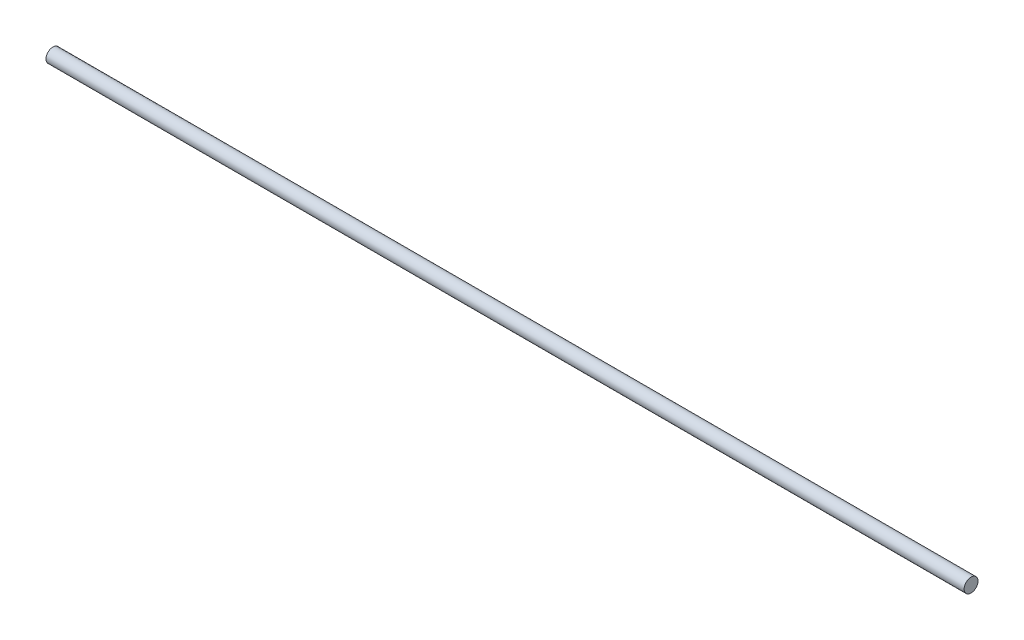
ISO-10303-21;
HEADER;
FILE_DESCRIPTION(('STEP AP214'),'2;1');
FILE_NAME('part.step','',(''),(''),'','','');
FILE_SCHEMA(('AUTOMOTIVE_DESIGN { 1 0 10303 214 1 1 1 1 }'));
ENDSEC;
DATA;
#1=APPLICATION_CONTEXT('core data for automotive mechanical design processes');
#2=APPLICATION_PROTOCOL_DEFINITION('international standard','automotive_design',2000,#1);
#3=PRODUCT_CONTEXT('',#1,'mechanical');
#4=PRODUCT('Part','Part','',(#3));
#5=PRODUCT_RELATED_PRODUCT_CATEGORY('part','',(#4));
#6=PRODUCT_DEFINITION_FORMATION('','',#4);
#7=PRODUCT_DEFINITION_CONTEXT('part definition',#1,'design');
#8=PRODUCT_DEFINITION('design','',#6,#7);
#9=PRODUCT_DEFINITION_SHAPE('','',#8);
#10=(LENGTH_UNIT() NAMED_UNIT(*) SI_UNIT(.MILLI.,.METRE.));
#11=(NAMED_UNIT(*) PLANE_ANGLE_UNIT() SI_UNIT($,.RADIAN.));
#12=(NAMED_UNIT(*) SI_UNIT($,.STERADIAN.) SOLID_ANGLE_UNIT());
#13=UNCERTAINTY_MEASURE_WITH_UNIT(LENGTH_MEASURE(1.E-05),#10,'distance_accuracy_value','');
#14=(GEOMETRIC_REPRESENTATION_CONTEXT(3) GLOBAL_UNCERTAINTY_ASSIGNED_CONTEXT((#13)) GLOBAL_UNIT_ASSIGNED_CONTEXT((#10,
#11,#12)) REPRESENTATION_CONTEXT('',''));
#15=CARTESIAN_POINT('',(0.,0.,0.));
#16=DIRECTION('',(0.,0.,1.));
#17=DIRECTION('',(1.,0.,0.));
#18=AXIS2_PLACEMENT_3D('',#15,#16,#17);
#19=CARTESIAN_POINT('',(530.,0.,0.));
#20=DIRECTION('',(-1.,0.,0.));
#21=DIRECTION('',(0.,0.,1.));
#22=AXIS2_PLACEMENT_3D('',#19,#20,#21);
#23=CYLINDRICAL_SURFACE('',#22,4.);
#24=CARTESIAN_POINT('',(530.,0.,0.));
#25=DIRECTION('',(1.,0.,0.));
#26=DIRECTION('',(0.,0.,-1.));
#27=AXIS2_PLACEMENT_3D('',#24,#25,#26);
#28=CIRCLE('',#27,4.);
#29=CARTESIAN_POINT('',(530.,0.,-4.));
#30=VERTEX_POINT('',#29);
#31=EDGE_CURVE('E10',#30,#30,#28,.T.);
#32=ORIENTED_EDGE('',*,*,#31,.F.);
#33=EDGE_LOOP('',(#32));
#34=FACE_BOUND('',#33,.T.);
#35=CARTESIAN_POINT('',(0.,0.,0.));
#36=DIRECTION('',(1.,0.,0.));
#37=DIRECTION('',(0.,0.,-1.));
#38=AXIS2_PLACEMENT_3D('',#35,#36,#37);
#39=CIRCLE('',#38,4.);
#40=CARTESIAN_POINT('',(0.,0.,-4.));
#41=VERTEX_POINT('',#40);
#42=EDGE_CURVE('E34',#41,#41,#39,.T.);
#43=ORIENTED_EDGE('',*,*,#42,.T.);
#44=EDGE_LOOP('',(#43));
#45=FACE_BOUND('',#44,.T.);
#46=ADVANCED_FACE('F31',(#34,#45),#23,.T.);
#47=CARTESIAN_POINT('',(530.,0.,0.));
#48=DIRECTION('',(1.,0.,0.));
#49=DIRECTION('',(0.,0.,-1.));
#50=AXIS2_PLACEMENT_3D('',#47,#48,#49);
#51=PLANE('',#50);
#52=ORIENTED_EDGE('',*,*,#31,.T.);
#53=EDGE_LOOP('',(#52));
#54=FACE_BOUND('',#53,.T.);
#55=ADVANCED_FACE('F46',(#54),#51,.T.);
#56=CARTESIAN_POINT('',(0.,0.,0.));
#57=DIRECTION('',(1.,0.,0.));
#58=DIRECTION('',(0.,0.,-1.));
#59=AXIS2_PLACEMENT_3D('',#56,#57,#58);
#60=PLANE('',#59);
#61=ORIENTED_EDGE('',*,*,#42,.F.);
#62=EDGE_LOOP('',(#61));
#63=FACE_BOUND('',#62,.T.);
#64=ADVANCED_FACE('F44',(#63),#60,.F.);
#65=CLOSED_SHELL('',(#46,#55,#64));
#66=MANIFOLD_SOLID_BREP('B2',#65);
#67=ADVANCED_BREP_SHAPE_REPRESENTATION('',(#18,#66),#14);
#68=SHAPE_DEFINITION_REPRESENTATION(#9,#67);
ENDSEC;
END-ISO-10303-21;
